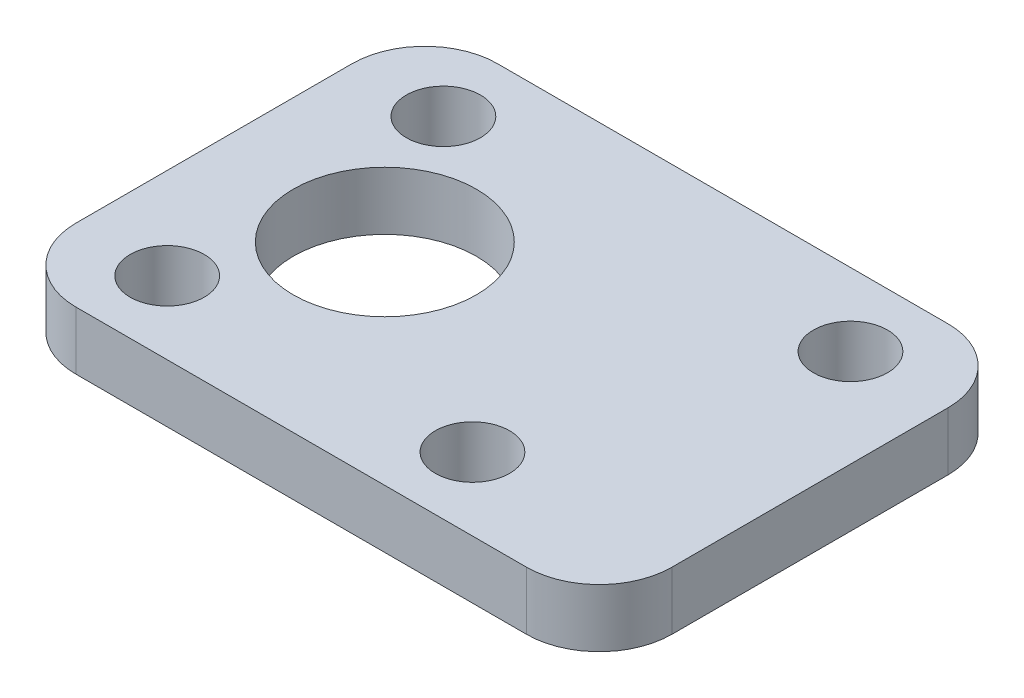
ISO-10303-21;
HEADER;
FILE_DESCRIPTION(('STEP AP214'),'2;1');
FILE_NAME('part.step','',(''),(''),'','','');
FILE_SCHEMA(('AUTOMOTIVE_DESIGN { 1 0 10303 214 1 1 1 1 }'));
ENDSEC;
DATA;
#1=APPLICATION_CONTEXT('core data for automotive mechanical design processes');
#2=APPLICATION_PROTOCOL_DEFINITION('international standard','automotive_design',2000,#1);
#3=PRODUCT_CONTEXT('',#1,'mechanical');
#4=PRODUCT('Part','Part','',(#3));
#5=PRODUCT_RELATED_PRODUCT_CATEGORY('part','',(#4));
#6=PRODUCT_DEFINITION_FORMATION('','',#4);
#7=PRODUCT_DEFINITION_CONTEXT('part definition',#1,'design');
#8=PRODUCT_DEFINITION('design','',#6,#7);
#9=PRODUCT_DEFINITION_SHAPE('','',#8);
#10=(LENGTH_UNIT() NAMED_UNIT(*) SI_UNIT(.MILLI.,.METRE.));
#11=(NAMED_UNIT(*) PLANE_ANGLE_UNIT() SI_UNIT($,.RADIAN.));
#12=(NAMED_UNIT(*) SI_UNIT($,.STERADIAN.) SOLID_ANGLE_UNIT());
#13=UNCERTAINTY_MEASURE_WITH_UNIT(LENGTH_MEASURE(1.E-05),#10,'distance_accuracy_value','');
#14=(GEOMETRIC_REPRESENTATION_CONTEXT(3) GLOBAL_UNCERTAINTY_ASSIGNED_CONTEXT((#13)) GLOBAL_UNIT_ASSIGNED_CONTEXT((#10,
#11,#12)) REPRESENTATION_CONTEXT('',''));
#15=CARTESIAN_POINT('',(0.,0.,0.));
#16=DIRECTION('',(0.,0.,1.));
#17=DIRECTION('',(1.,0.,0.));
#18=AXIS2_PLACEMENT_3D('',#15,#16,#17);
#19=CARTESIAN_POINT('',(0.,8.,0.));
#20=DIRECTION('',(0.,0.,-1.));
#21=DIRECTION('',(-1.,0.,0.));
#22=AXIS2_PLACEMENT_3D('',#19,#20,#21);
#23=PLANE('',#22);
#24=DIRECTION('',(1.,0.,0.));
#25=VECTOR('',#24,1.);
#26=CARTESIAN_POINT('',(0.,0.,0.));
#27=LINE('',#26,#25);
#28=CARTESIAN_POINT('',(10.,0.,0.));
#29=VERTEX_POINT('',#28);
#30=CARTESIAN_POINT('',(72.,0.,0.));
#31=VERTEX_POINT('',#30);
#32=EDGE_CURVE('E140',#29,#31,#27,.T.);
#33=ORIENTED_EDGE('',*,*,#32,.T.);
#34=DIRECTION('',(0.,-1.,0.));
#35=VECTOR('',#34,1.);
#36=CARTESIAN_POINT('',(72.,8.,0.));
#37=LINE('',#36,#35);
#38=CARTESIAN_POINT('',(72.,8.,0.));
#39=VERTEX_POINT('',#38);
#40=EDGE_CURVE('E115',#31,#39,#37,.F.);
#41=ORIENTED_EDGE('',*,*,#40,.T.);
#42=DIRECTION('',(1.,0.,0.));
#43=VECTOR('',#42,1.);
#44=CARTESIAN_POINT('',(0.,8.,0.));
#45=LINE('',#44,#43);
#46=CARTESIAN_POINT('',(10.,8.,0.));
#47=VERTEX_POINT('',#46);
#48=EDGE_CURVE('E279',#47,#39,#45,.T.);
#49=ORIENTED_EDGE('',*,*,#48,.F.);
#50=DIRECTION('',(0.,-1.,0.));
#51=VECTOR('',#50,1.);
#52=CARTESIAN_POINT('',(10.,0.,0.));
#53=LINE('',#52,#51);
#54=EDGE_CURVE('E121',#47,#29,#53,.T.);
#55=ORIENTED_EDGE('',*,*,#54,.T.);
#56=EDGE_LOOP('',(#33,#41,#49,#55));
#57=FACE_BOUND('',#56,.T.);
#58=ADVANCED_FACE('F43',(#57),#23,.F.);
#59=CARTESIAN_POINT('',(82.,8.,0.));
#60=DIRECTION('',(-1.,0.,0.));
#61=DIRECTION('',(0.,0.,1.));
#62=AXIS2_PLACEMENT_3D('',#59,#60,#61);
#63=PLANE('',#62);
#64=DIRECTION('',(0.,0.,-1.));
#65=VECTOR('',#64,1.);
#66=CARTESIAN_POINT('',(82.,8.,0.));
#67=LINE('',#66,#65);
#68=CARTESIAN_POINT('',(82.,8.,-10.));
#69=VERTEX_POINT('',#68);
#70=CARTESIAN_POINT('',(82.,8.,-48.));
#71=VERTEX_POINT('',#70);
#72=EDGE_CURVE('E131',#69,#71,#67,.T.);
#73=ORIENTED_EDGE('',*,*,#72,.F.);
#74=DIRECTION('',(0.,-1.,0.));
#75=VECTOR('',#74,1.);
#76=CARTESIAN_POINT('',(82.,8.,-10.));
#77=LINE('',#76,#75);
#78=CARTESIAN_POINT('',(82.,0.,-10.));
#79=VERTEX_POINT('',#78);
#80=EDGE_CURVE('E114',#69,#79,#77,.T.);
#81=ORIENTED_EDGE('',*,*,#80,.T.);
#82=DIRECTION('',(0.,0.,-1.));
#83=VECTOR('',#82,1.);
#84=CARTESIAN_POINT('',(82.,0.,0.));
#85=LINE('',#84,#83);
#86=CARTESIAN_POINT('',(82.,0.,-48.));
#87=VERTEX_POINT('',#86);
#88=EDGE_CURVE('E128',#79,#87,#85,.T.);
#89=ORIENTED_EDGE('',*,*,#88,.T.);
#90=DIRECTION('',(0.,-1.,0.));
#91=VECTOR('',#90,1.);
#92=CARTESIAN_POINT('',(82.,8.,-48.));
#93=LINE('',#92,#91);
#94=EDGE_CURVE('E134',#87,#71,#93,.F.);
#95=ORIENTED_EDGE('',*,*,#94,.T.);
#96=EDGE_LOOP('',(#73,#81,#89,#95));
#97=FACE_BOUND('',#96,.T.);
#98=ADVANCED_FACE('F127',(#97),#63,.F.);
#99=CARTESIAN_POINT('',(0.,8.,-58.));
#100=DIRECTION('',(0.,0.,-1.));
#101=DIRECTION('',(-1.,0.,0.));
#102=AXIS2_PLACEMENT_3D('',#99,#100,#101);
#103=PLANE('',#102);
#104=DIRECTION('',(1.,0.,0.));
#105=VECTOR('',#104,1.);
#106=CARTESIAN_POINT('',(0.,0.,-58.));
#107=LINE('',#106,#105);
#108=CARTESIAN_POINT('',(10.,0.,-58.));
#109=VERTEX_POINT('',#108);
#110=CARTESIAN_POINT('',(72.,0.,-58.));
#111=VERTEX_POINT('',#110);
#112=EDGE_CURVE('E139',#109,#111,#107,.T.);
#113=ORIENTED_EDGE('',*,*,#112,.F.);
#114=DIRECTION('',(0.,-1.,0.));
#115=VECTOR('',#114,1.);
#116=CARTESIAN_POINT('',(10.,8.,-58.));
#117=LINE('',#116,#115);
#118=CARTESIAN_POINT('',(10.,8.,-58.));
#119=VERTEX_POINT('',#118);
#120=EDGE_CURVE('E11',#109,#119,#117,.F.);
#121=ORIENTED_EDGE('',*,*,#120,.T.);
#122=DIRECTION('',(1.,0.,0.));
#123=VECTOR('',#122,1.);
#124=CARTESIAN_POINT('',(0.,8.,-58.));
#125=LINE('',#124,#123);
#126=CARTESIAN_POINT('',(72.,8.,-58.));
#127=VERTEX_POINT('',#126);
#128=EDGE_CURVE('E193',#119,#127,#125,.T.);
#129=ORIENTED_EDGE('',*,*,#128,.T.);
#130=DIRECTION('',(0.,-1.,0.));
#131=VECTOR('',#130,1.);
#132=CARTESIAN_POINT('',(72.,0.,-58.));
#133=LINE('',#132,#131);
#134=EDGE_CURVE('E52',#127,#111,#133,.T.);
#135=ORIENTED_EDGE('',*,*,#134,.T.);
#136=EDGE_LOOP('',(#113,#121,#129,#135));
#137=FACE_BOUND('',#136,.T.);
#138=ADVANCED_FACE('F191',(#137),#103,.T.);
#139=CARTESIAN_POINT('',(12.5610742738781,8.,-48.));
#140=DIRECTION('',(0.,-1.,0.));
#141=DIRECTION('',(0.,0.,-1.));
#142=AXIS2_PLACEMENT_3D('',#139,#140,#141);
#143=CYLINDRICAL_SURFACE('',#142,5.1);
#144=CARTESIAN_POINT('',(12.5610742738781,8.,-48.));
#145=DIRECTION('',(0.,1.,0.));
#146=DIRECTION('',(0.,0.,1.));
#147=AXIS2_PLACEMENT_3D('',#144,#145,#146);
#148=CIRCLE('',#147,5.1);
#149=CARTESIAN_POINT('',(12.5610742738781,8.,-42.9));
#150=VERTEX_POINT('',#149);
#151=EDGE_CURVE('E276',#150,#150,#148,.T.);
#152=ORIENTED_EDGE('',*,*,#151,.T.);
#153=EDGE_LOOP('',(#152));
#154=FACE_BOUND('',#153,.T.);
#155=CARTESIAN_POINT('',(12.5610742738781,0.,-48.));
#156=DIRECTION('',(0.,1.,0.));
#157=DIRECTION('',(0.,0.,1.));
#158=AXIS2_PLACEMENT_3D('',#155,#156,#157);
#159=CIRCLE('',#158,5.1);
#160=CARTESIAN_POINT('',(12.5610742738781,0.,-42.9));
#161=VERTEX_POINT('',#160);
#162=EDGE_CURVE('E146',#161,#161,#159,.T.);
#163=ORIENTED_EDGE('',*,*,#162,.F.);
#164=EDGE_LOOP('',(#163));
#165=FACE_BOUND('',#164,.T.);
#166=ADVANCED_FACE('F227',(#154,#165),#143,.F.);
#167=CARTESIAN_POINT('',(12.5610742738781,8.,-10.));
#168=DIRECTION('',(0.,-1.,0.));
#169=DIRECTION('',(0.,0.,-1.));
#170=AXIS2_PLACEMENT_3D('',#167,#168,#169);
#171=CYLINDRICAL_SURFACE('',#170,5.1);
#172=CARTESIAN_POINT('',(12.5610742738781,8.,-10.));
#173=DIRECTION('',(0.,1.,0.));
#174=DIRECTION('',(0.,0.,1.));
#175=AXIS2_PLACEMENT_3D('',#172,#173,#174);
#176=CIRCLE('',#175,5.1);
#177=CARTESIAN_POINT('',(12.5610742738781,8.,-4.9));
#178=VERTEX_POINT('',#177);
#179=EDGE_CURVE('E274',#178,#178,#176,.T.);
#180=ORIENTED_EDGE('',*,*,#179,.T.);
#181=EDGE_LOOP('',(#180));
#182=FACE_BOUND('',#181,.T.);
#183=CARTESIAN_POINT('',(12.5610742738781,0.,-10.));
#184=DIRECTION('',(0.,1.,0.));
#185=DIRECTION('',(0.,0.,1.));
#186=AXIS2_PLACEMENT_3D('',#183,#184,#185);
#187=CIRCLE('',#186,5.1);
#188=CARTESIAN_POINT('',(12.5610742738781,0.,-4.9));
#189=VERTEX_POINT('',#188);
#190=EDGE_CURVE('E219',#189,#189,#187,.T.);
#191=ORIENTED_EDGE('',*,*,#190,.F.);
#192=EDGE_LOOP('',(#191));
#193=FACE_BOUND('',#192,.T.);
#194=ADVANCED_FACE('F229',(#182,#193),#171,.F.);
#195=CARTESIAN_POINT('',(54.5610742738781,8.,-10.));
#196=DIRECTION('',(0.,-1.,0.));
#197=DIRECTION('',(0.,0.,-1.));
#198=AXIS2_PLACEMENT_3D('',#195,#196,#197);
#199=CYLINDRICAL_SURFACE('',#198,5.10000000000001);
#200=CARTESIAN_POINT('',(54.5610742738781,8.,-10.));
#201=DIRECTION('',(0.,1.,0.));
#202=DIRECTION('',(0.,0.,1.));
#203=AXIS2_PLACEMENT_3D('',#200,#201,#202);
#204=CIRCLE('',#203,5.10000000000001);
#205=CARTESIAN_POINT('',(54.5610742738781,8.,-4.9));
#206=VERTEX_POINT('',#205);
#207=EDGE_CURVE('E270',#206,#206,#204,.T.);
#208=ORIENTED_EDGE('',*,*,#207,.T.);
#209=EDGE_LOOP('',(#208));
#210=FACE_BOUND('',#209,.T.);
#211=CARTESIAN_POINT('',(54.5610742738781,0.,-10.));
#212=DIRECTION('',(0.,1.,0.));
#213=DIRECTION('',(0.,0.,1.));
#214=AXIS2_PLACEMENT_3D('',#211,#212,#213);
#215=CIRCLE('',#214,5.10000000000001);
#216=CARTESIAN_POINT('',(54.5610742738781,0.,-4.9));
#217=VERTEX_POINT('',#216);
#218=EDGE_CURVE('E215',#217,#217,#215,.T.);
#219=ORIENTED_EDGE('',*,*,#218,.F.);
#220=EDGE_LOOP('',(#219));
#221=FACE_BOUND('',#220,.T.);
#222=ADVANCED_FACE('F236',(#210,#221),#199,.F.);
#223=CARTESIAN_POINT('',(68.57,8.,-48.));
#224=DIRECTION('',(0.,-1.,0.));
#225=DIRECTION('',(0.,0.,-1.));
#226=AXIS2_PLACEMENT_3D('',#223,#224,#225);
#227=CYLINDRICAL_SURFACE('',#226,5.1);
#228=CARTESIAN_POINT('',(68.57,8.,-48.));
#229=DIRECTION('',(0.,1.,0.));
#230=DIRECTION('',(0.,0.,1.));
#231=AXIS2_PLACEMENT_3D('',#228,#229,#230);
#232=CIRCLE('',#231,5.1);
#233=CARTESIAN_POINT('',(68.57,8.,-42.9));
#234=VERTEX_POINT('',#233);
#235=EDGE_CURVE('E266',#234,#234,#232,.T.);
#236=ORIENTED_EDGE('',*,*,#235,.T.);
#237=EDGE_LOOP('',(#236));
#238=FACE_BOUND('',#237,.T.);
#239=CARTESIAN_POINT('',(68.57,0.,-48.));
#240=DIRECTION('',(0.,1.,0.));
#241=DIRECTION('',(0.,0.,1.));
#242=AXIS2_PLACEMENT_3D('',#239,#240,#241);
#243=CIRCLE('',#242,5.1);
#244=CARTESIAN_POINT('',(68.57,0.,-42.9));
#245=VERTEX_POINT('',#244);
#246=EDGE_CURVE('E211',#245,#245,#243,.T.);
#247=ORIENTED_EDGE('',*,*,#246,.F.);
#248=EDGE_LOOP('',(#247));
#249=FACE_BOUND('',#248,.T.);
#250=ADVANCED_FACE('F297',(#238,#249),#227,.F.);
#251=CARTESIAN_POINT('',(23.5,8.,-29.));
#252=DIRECTION('',(0.,-1.,0.));
#253=DIRECTION('',(0.,0.,-1.));
#254=AXIS2_PLACEMENT_3D('',#251,#252,#253);
#255=CYLINDRICAL_SURFACE('',#254,12.6);
#256=CARTESIAN_POINT('',(23.5,8.,-29.));
#257=DIRECTION('',(0.,1.,0.));
#258=DIRECTION('',(0.,0.,1.));
#259=AXIS2_PLACEMENT_3D('',#256,#257,#258);
#260=CIRCLE('',#259,12.6);
#261=CARTESIAN_POINT('',(23.5,8.,-16.4));
#262=VERTEX_POINT('',#261);
#263=EDGE_CURVE('E153',#262,#262,#260,.T.);
#264=ORIENTED_EDGE('',*,*,#263,.T.);
#265=EDGE_LOOP('',(#264));
#266=FACE_BOUND('',#265,.T.);
#267=CARTESIAN_POINT('',(23.5,0.,-29.));
#268=DIRECTION('',(0.,1.,0.));
#269=DIRECTION('',(0.,0.,1.));
#270=AXIS2_PLACEMENT_3D('',#267,#268,#269);
#271=CIRCLE('',#270,12.6);
#272=CARTESIAN_POINT('',(23.5,0.,-16.4));
#273=VERTEX_POINT('',#272);
#274=EDGE_CURVE('E207',#273,#273,#271,.T.);
#275=ORIENTED_EDGE('',*,*,#274,.F.);
#276=EDGE_LOOP('',(#275));
#277=FACE_BOUND('',#276,.T.);
#278=ADVANCED_FACE('F252',(#266,#277),#255,.F.);
#279=CARTESIAN_POINT('',(0.,8.,0.));
#280=DIRECTION('',(-1.,0.,0.));
#281=DIRECTION('',(0.,0.,1.));
#282=AXIS2_PLACEMENT_3D('',#279,#280,#281);
#283=PLANE('',#282);
#284=DIRECTION('',(0.,0.,-1.));
#285=VECTOR('',#284,1.);
#286=CARTESIAN_POINT('',(0.,0.,0.));
#287=LINE('',#286,#285);
#288=CARTESIAN_POINT('',(0.,0.,-10.));
#289=VERTEX_POINT('',#288);
#290=CARTESIAN_POINT('',(0.,0.,-48.));
#291=VERTEX_POINT('',#290);
#292=EDGE_CURVE('E144',#289,#291,#287,.T.);
#293=ORIENTED_EDGE('',*,*,#292,.F.);
#294=DIRECTION('',(0.,-1.,0.));
#295=VECTOR('',#294,1.);
#296=CARTESIAN_POINT('',(0.,8.,-10.));
#297=LINE('',#296,#295);
#298=CARTESIAN_POINT('',(0.,8.,-10.));
#299=VERTEX_POINT('',#298);
#300=EDGE_CURVE('E66',#289,#299,#297,.F.);
#301=ORIENTED_EDGE('',*,*,#300,.T.);
#302=DIRECTION('',(0.,0.,-1.));
#303=VECTOR('',#302,1.);
#304=CARTESIAN_POINT('',(0.,8.,0.));
#305=LINE('',#304,#303);
#306=CARTESIAN_POINT('',(0.,8.,-48.));
#307=VERTEX_POINT('',#306);
#308=EDGE_CURVE('E155',#299,#307,#305,.T.);
#309=ORIENTED_EDGE('',*,*,#308,.T.);
#310=DIRECTION('',(0.,-1.,0.));
#311=VECTOR('',#310,1.);
#312=CARTESIAN_POINT('',(0.,8.,-48.));
#313=LINE('',#312,#311);
#314=EDGE_CURVE('E180',#307,#291,#313,.T.);
#315=ORIENTED_EDGE('',*,*,#314,.T.);
#316=EDGE_LOOP('',(#293,#301,#309,#315));
#317=FACE_BOUND('',#316,.T.);
#318=ADVANCED_FACE('F199',(#317),#283,.T.);
#319=CARTESIAN_POINT('',(0.,8.,0.));
#320=DIRECTION('',(0.,1.,0.));
#321=DIRECTION('',(0.,0.,1.));
#322=AXIS2_PLACEMENT_3D('',#319,#320,#321);
#323=PLANE('',#322);
#324=ORIENTED_EDGE('',*,*,#263,.F.);
#325=EDGE_LOOP('',(#324));
#326=FACE_BOUND('',#325,.T.);
#327=ORIENTED_EDGE('',*,*,#235,.F.);
#328=EDGE_LOOP('',(#327));
#329=FACE_BOUND('',#328,.T.);
#330=ORIENTED_EDGE('',*,*,#207,.F.);
#331=EDGE_LOOP('',(#330));
#332=FACE_BOUND('',#331,.T.);
#333=ORIENTED_EDGE('',*,*,#179,.F.);
#334=EDGE_LOOP('',(#333));
#335=FACE_BOUND('',#334,.T.);
#336=ORIENTED_EDGE('',*,*,#151,.F.);
#337=EDGE_LOOP('',(#336));
#338=FACE_BOUND('',#337,.T.);
#339=ORIENTED_EDGE('',*,*,#48,.T.);
#340=CARTESIAN_POINT('',(72.,8.,-10.));
#341=DIRECTION('',(0.,1.,0.));
#342=DIRECTION('',(0.,0.,1.));
#343=AXIS2_PLACEMENT_3D('',#340,#341,#342);
#344=CIRCLE('',#343,10.);
#345=EDGE_CURVE('E177',#39,#69,#344,.T.);
#346=ORIENTED_EDGE('',*,*,#345,.T.);
#347=ORIENTED_EDGE('',*,*,#72,.T.);
#348=CARTESIAN_POINT('',(72.,8.,-48.));
#349=DIRECTION('',(0.,1.,0.));
#350=DIRECTION('',(0.,0.,1.));
#351=AXIS2_PLACEMENT_3D('',#348,#349,#350);
#352=CIRCLE('',#351,10.);
#353=EDGE_CURVE('E169',#71,#127,#352,.T.);
#354=ORIENTED_EDGE('',*,*,#353,.T.);
#355=ORIENTED_EDGE('',*,*,#128,.F.);
#356=CARTESIAN_POINT('',(10.,8.,-48.));
#357=DIRECTION('',(0.,1.,0.));
#358=DIRECTION('',(0.,0.,1.));
#359=AXIS2_PLACEMENT_3D('',#356,#357,#358);
#360=CIRCLE('',#359,10.);
#361=EDGE_CURVE('E59',#119,#307,#360,.T.);
#362=ORIENTED_EDGE('',*,*,#361,.T.);
#363=ORIENTED_EDGE('',*,*,#308,.F.);
#364=CARTESIAN_POINT('',(10.,8.,-10.));
#365=DIRECTION('',(0.,1.,0.));
#366=DIRECTION('',(0.,0.,1.));
#367=AXIS2_PLACEMENT_3D('',#364,#365,#366);
#368=CIRCLE('',#367,10.);
#369=EDGE_CURVE('E174',#299,#47,#368,.T.);
#370=ORIENTED_EDGE('',*,*,#369,.T.);
#371=EDGE_LOOP('',(#339,#346,#347,#354,#355,#362,#363,#370));
#372=FACE_BOUND('',#371,.T.);
#373=ADVANCED_FACE('F251',(#326,#329,#332,#335,#338,#372),#323,.T.);
#374=CARTESIAN_POINT('',(0.,0.,0.));
#375=DIRECTION('',(0.,1.,0.));
#376=DIRECTION('',(0.,0.,1.));
#377=AXIS2_PLACEMENT_3D('',#374,#375,#376);
#378=PLANE('',#377);
#379=ORIENTED_EDGE('',*,*,#274,.T.);
#380=EDGE_LOOP('',(#379));
#381=FACE_BOUND('',#380,.T.);
#382=ORIENTED_EDGE('',*,*,#246,.T.);
#383=EDGE_LOOP('',(#382));
#384=FACE_BOUND('',#383,.T.);
#385=ORIENTED_EDGE('',*,*,#218,.T.);
#386=EDGE_LOOP('',(#385));
#387=FACE_BOUND('',#386,.T.);
#388=ORIENTED_EDGE('',*,*,#190,.T.);
#389=EDGE_LOOP('',(#388));
#390=FACE_BOUND('',#389,.T.);
#391=ORIENTED_EDGE('',*,*,#162,.T.);
#392=EDGE_LOOP('',(#391));
#393=FACE_BOUND('',#392,.T.);
#394=ORIENTED_EDGE('',*,*,#88,.F.);
#395=CARTESIAN_POINT('',(72.,0.,-10.));
#396=DIRECTION('',(0.,1.,0.));
#397=DIRECTION('',(0.,0.,1.));
#398=AXIS2_PLACEMENT_3D('',#395,#396,#397);
#399=CIRCLE('',#398,10.);
#400=EDGE_CURVE('E110',#79,#31,#399,.F.);
#401=ORIENTED_EDGE('',*,*,#400,.T.);
#402=ORIENTED_EDGE('',*,*,#32,.F.);
#403=CARTESIAN_POINT('',(10.,0.,-10.));
#404=DIRECTION('',(0.,1.,0.));
#405=DIRECTION('',(0.,0.,1.));
#406=AXIS2_PLACEMENT_3D('',#403,#404,#405);
#407=CIRCLE('',#406,10.);
#408=EDGE_CURVE('E122',#29,#289,#407,.F.);
#409=ORIENTED_EDGE('',*,*,#408,.T.);
#410=ORIENTED_EDGE('',*,*,#292,.T.);
#411=CARTESIAN_POINT('',(10.,0.,-48.));
#412=DIRECTION('',(0.,1.,0.));
#413=DIRECTION('',(0.,0.,1.));
#414=AXIS2_PLACEMENT_3D('',#411,#412,#413);
#415=CIRCLE('',#414,10.);
#416=EDGE_CURVE('E159',#291,#109,#415,.F.);
#417=ORIENTED_EDGE('',*,*,#416,.T.);
#418=ORIENTED_EDGE('',*,*,#112,.T.);
#419=CARTESIAN_POINT('',(72.,0.,-48.));
#420=DIRECTION('',(0.,1.,0.));
#421=DIRECTION('',(0.,0.,1.));
#422=AXIS2_PLACEMENT_3D('',#419,#420,#421);
#423=CIRCLE('',#422,10.);
#424=EDGE_CURVE('E133',#111,#87,#423,.F.);
#425=ORIENTED_EDGE('',*,*,#424,.T.);
#426=EDGE_LOOP('',(#394,#401,#402,#409,#410,#417,#418,#425));
#427=FACE_BOUND('',#426,.T.);
#428=ADVANCED_FACE('F136',(#381,#384,#387,#390,#393,#427),#378,.F.);
#429=CARTESIAN_POINT('',(72.,8.,-10.));
#430=DIRECTION('',(0.,-1.,0.));
#431=DIRECTION('',(0.,0.,-1.));
#432=AXIS2_PLACEMENT_3D('',#429,#430,#431);
#433=CYLINDRICAL_SURFACE('',#432,10.);
#434=ORIENTED_EDGE('',*,*,#345,.F.);
#435=ORIENTED_EDGE('',*,*,#40,.F.);
#436=ORIENTED_EDGE('',*,*,#400,.F.);
#437=ORIENTED_EDGE('',*,*,#80,.F.);
#438=EDGE_LOOP('',(#434,#435,#436,#437));
#439=FACE_BOUND('',#438,.T.);
#440=ADVANCED_FACE('F113',(#439),#433,.T.);
#441=CARTESIAN_POINT('',(10.,8.,-10.));
#442=DIRECTION('',(0.,1.,0.));
#443=DIRECTION('',(0.,0.,1.));
#444=AXIS2_PLACEMENT_3D('',#441,#442,#443);
#445=CYLINDRICAL_SURFACE('',#444,10.);
#446=ORIENTED_EDGE('',*,*,#369,.F.);
#447=ORIENTED_EDGE('',*,*,#300,.F.);
#448=ORIENTED_EDGE('',*,*,#408,.F.);
#449=ORIENTED_EDGE('',*,*,#54,.F.);
#450=EDGE_LOOP('',(#446,#447,#448,#449));
#451=FACE_BOUND('',#450,.T.);
#452=ADVANCED_FACE('F319',(#451),#445,.T.);
#453=CARTESIAN_POINT('',(10.,8.,-48.));
#454=DIRECTION('',(0.,-1.,0.));
#455=DIRECTION('',(0.,0.,-1.));
#456=AXIS2_PLACEMENT_3D('',#453,#454,#455);
#457=CYLINDRICAL_SURFACE('',#456,10.);
#458=ORIENTED_EDGE('',*,*,#361,.F.);
#459=ORIENTED_EDGE('',*,*,#120,.F.);
#460=ORIENTED_EDGE('',*,*,#416,.F.);
#461=ORIENTED_EDGE('',*,*,#314,.F.);
#462=EDGE_LOOP('',(#458,#459,#460,#461));
#463=FACE_BOUND('',#462,.T.);
#464=ADVANCED_FACE('F198',(#463),#457,.T.);
#465=CARTESIAN_POINT('',(72.,8.,-48.));
#466=DIRECTION('',(0.,1.,0.));
#467=DIRECTION('',(0.,0.,1.));
#468=AXIS2_PLACEMENT_3D('',#465,#466,#467);
#469=CYLINDRICAL_SURFACE('',#468,10.);
#470=ORIENTED_EDGE('',*,*,#353,.F.);
#471=ORIENTED_EDGE('',*,*,#94,.F.);
#472=ORIENTED_EDGE('',*,*,#424,.F.);
#473=ORIENTED_EDGE('',*,*,#134,.F.);
#474=EDGE_LOOP('',(#470,#471,#472,#473));
#475=FACE_BOUND('',#474,.T.);
#476=ADVANCED_FACE('F45',(#475),#469,.T.);
#477=CLOSED_SHELL('',(#58,#98,#138,#166,#194,#222,#250,#278,#318,#373,#428,#440,#452,#464,#476));
#478=MANIFOLD_SOLID_BREP('B2',#477);
#479=ADVANCED_BREP_SHAPE_REPRESENTATION('',(#18,#478),#14);
#480=SHAPE_DEFINITION_REPRESENTATION(#9,#479);
ENDSEC;
END-ISO-10303-21;
